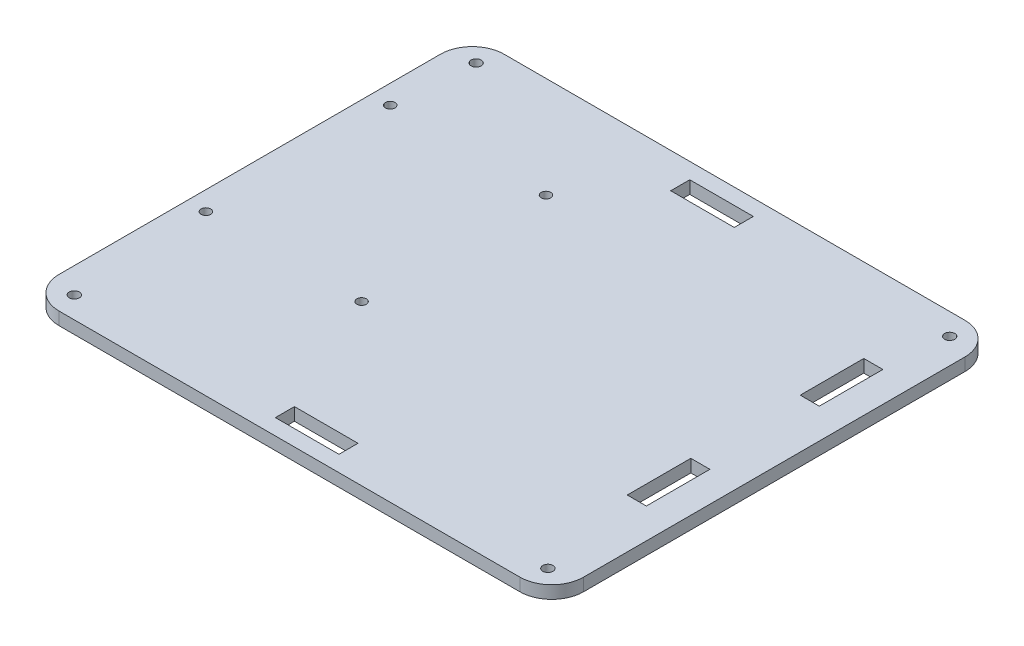
ISO-10303-21;
HEADER;
FILE_DESCRIPTION(('STEP AP214'),'2;1');
FILE_NAME('part.step','',(''),(''),'','','');
FILE_SCHEMA(('AUTOMOTIVE_DESIGN { 1 0 10303 214 1 1 1 1 }'));
ENDSEC;
DATA;
#1=APPLICATION_CONTEXT('core data for automotive mechanical design processes');
#2=APPLICATION_PROTOCOL_DEFINITION('international standard','automotive_design',2000,#1);
#3=PRODUCT_CONTEXT('',#1,'mechanical');
#4=PRODUCT('Part','Part','',(#3));
#5=PRODUCT_RELATED_PRODUCT_CATEGORY('part','',(#4));
#6=PRODUCT_DEFINITION_FORMATION('','',#4);
#7=PRODUCT_DEFINITION_CONTEXT('part definition',#1,'design');
#8=PRODUCT_DEFINITION('design','',#6,#7);
#9=PRODUCT_DEFINITION_SHAPE('','',#8);
#10=(LENGTH_UNIT() NAMED_UNIT(*) SI_UNIT(.MILLI.,.METRE.));
#11=(NAMED_UNIT(*) PLANE_ANGLE_UNIT() SI_UNIT($,.RADIAN.));
#12=(NAMED_UNIT(*) SI_UNIT($,.STERADIAN.) SOLID_ANGLE_UNIT());
#13=UNCERTAINTY_MEASURE_WITH_UNIT(LENGTH_MEASURE(1.E-05),#10,'distance_accuracy_value','');
#14=(GEOMETRIC_REPRESENTATION_CONTEXT(3) GLOBAL_UNCERTAINTY_ASSIGNED_CONTEXT((#13)) GLOBAL_UNIT_ASSIGNED_CONTEXT((#10,
#11,#12)) REPRESENTATION_CONTEXT('',''));
#15=CARTESIAN_POINT('',(0.,0.,0.));
#16=DIRECTION('',(0.,0.,1.));
#17=DIRECTION('',(1.,0.,0.));
#18=AXIS2_PLACEMENT_3D('',#15,#16,#17);
#19=CARTESIAN_POINT('',(82.5,4.,-70.));
#20=DIRECTION('',(-1.,0.,0.));
#21=DIRECTION('',(0.,0.,1.));
#22=AXIS2_PLACEMENT_3D('',#19,#20,#21);
#23=PLANE('',#22);
#24=DIRECTION('',(0.,0.,-1.));
#25=VECTOR('',#24,1.);
#26=CARTESIAN_POINT('',(82.5,0.,-70.));
#27=LINE('',#26,#25);
#28=CARTESIAN_POINT('',(82.5,0.,60.));
#29=VERTEX_POINT('',#28);
#30=CARTESIAN_POINT('',(82.5,0.,-60.));
#31=VERTEX_POINT('',#30);
#32=EDGE_CURVE('E332',#29,#31,#27,.T.);
#33=ORIENTED_EDGE('',*,*,#32,.T.);
#34=DIRECTION('',(0.,-1.,0.));
#35=VECTOR('',#34,1.);
#36=CARTESIAN_POINT('',(82.5,4.,-60.));
#37=LINE('',#36,#35);
#38=CARTESIAN_POINT('',(82.5,4.,-60.));
#39=VERTEX_POINT('',#38);
#40=EDGE_CURVE('E369',#31,#39,#37,.F.);
#41=ORIENTED_EDGE('',*,*,#40,.T.);
#42=DIRECTION('',(0.,0.,-1.));
#43=VECTOR('',#42,1.);
#44=CARTESIAN_POINT('',(82.5,4.,-70.));
#45=LINE('',#44,#43);
#46=CARTESIAN_POINT('',(82.5,4.,60.));
#47=VERTEX_POINT('',#46);
#48=EDGE_CURVE('E318',#47,#39,#45,.T.);
#49=ORIENTED_EDGE('',*,*,#48,.F.);
#50=DIRECTION('',(0.,-1.,0.));
#51=VECTOR('',#50,1.);
#52=CARTESIAN_POINT('',(82.5,4.,60.));
#53=LINE('',#52,#51);
#54=EDGE_CURVE('E366',#47,#29,#53,.T.);
#55=ORIENTED_EDGE('',*,*,#54,.T.);
#56=EDGE_LOOP('',(#33,#41,#49,#55));
#57=FACE_BOUND('',#56,.T.);
#58=ADVANCED_FACE('F41',(#57),#23,.F.);
#59=CARTESIAN_POINT('',(-82.5,4.,-70.));
#60=DIRECTION('',(0.,0.,1.));
#61=DIRECTION('',(1.,0.,0.));
#62=AXIS2_PLACEMENT_3D('',#59,#60,#61);
#63=PLANE('',#62);
#64=DIRECTION('',(-1.,0.,0.));
#65=VECTOR('',#64,1.);
#66=CARTESIAN_POINT('',(-82.5,4.,-70.));
#67=LINE('',#66,#65);
#68=CARTESIAN_POINT('',(72.5,4.,-70.));
#69=VERTEX_POINT('',#68);
#70=CARTESIAN_POINT('',(-72.5,4.,-70.));
#71=VERTEX_POINT('',#70);
#72=EDGE_CURVE('E321',#69,#71,#67,.T.);
#73=ORIENTED_EDGE('',*,*,#72,.F.);
#74=DIRECTION('',(0.,-1.,0.));
#75=VECTOR('',#74,1.);
#76=CARTESIAN_POINT('',(72.5,4.,-70.));
#77=LINE('',#76,#75);
#78=CARTESIAN_POINT('',(72.5,0.,-70.));
#79=VERTEX_POINT('',#78);
#80=EDGE_CURVE('E355',#69,#79,#77,.T.);
#81=ORIENTED_EDGE('',*,*,#80,.T.);
#82=DIRECTION('',(-1.,0.,0.));
#83=VECTOR('',#82,1.);
#84=CARTESIAN_POINT('',(-82.5,0.,-70.));
#85=LINE('',#84,#83);
#86=CARTESIAN_POINT('',(-72.5,0.,-70.));
#87=VERTEX_POINT('',#86);
#88=EDGE_CURVE('E335',#79,#87,#85,.T.);
#89=ORIENTED_EDGE('',*,*,#88,.T.);
#90=DIRECTION('',(0.,-1.,0.));
#91=VECTOR('',#90,1.);
#92=CARTESIAN_POINT('',(-72.5,4.,-70.));
#93=LINE('',#92,#91);
#94=EDGE_CURVE('E331',#87,#71,#93,.F.);
#95=ORIENTED_EDGE('',*,*,#94,.T.);
#96=EDGE_LOOP('',(#73,#81,#89,#95));
#97=FACE_BOUND('',#96,.T.);
#98=ADVANCED_FACE('F470',(#97),#63,.F.);
#99=CARTESIAN_POINT('',(-82.5,4.,-70.));
#100=DIRECTION('',(1.,0.,0.));
#101=DIRECTION('',(0.,0.,-1.));
#102=AXIS2_PLACEMENT_3D('',#99,#100,#101);
#103=PLANE('',#102);
#104=DIRECTION('',(0.,0.,1.));
#105=VECTOR('',#104,1.);
#106=CARTESIAN_POINT('',(-82.5,4.,-70.));
#107=LINE('',#106,#105);
#108=CARTESIAN_POINT('',(-82.5,4.,-60.));
#109=VERTEX_POINT('',#108);
#110=CARTESIAN_POINT('',(-82.5,4.,60.));
#111=VERTEX_POINT('',#110);
#112=EDGE_CURVE('E325',#109,#111,#107,.T.);
#113=ORIENTED_EDGE('',*,*,#112,.F.);
#114=DIRECTION('',(0.,-1.,0.));
#115=VECTOR('',#114,1.);
#116=CARTESIAN_POINT('',(-82.5,4.,-60.));
#117=LINE('',#116,#115);
#118=CARTESIAN_POINT('',(-82.5,0.,-60.));
#119=VERTEX_POINT('',#118);
#120=EDGE_CURVE('E386',#109,#119,#117,.T.);
#121=ORIENTED_EDGE('',*,*,#120,.T.);
#122=DIRECTION('',(0.,0.,1.));
#123=VECTOR('',#122,1.);
#124=CARTESIAN_POINT('',(-82.5,0.,-70.));
#125=LINE('',#124,#123);
#126=CARTESIAN_POINT('',(-82.5,0.,60.));
#127=VERTEX_POINT('',#126);
#128=EDGE_CURVE('E339',#119,#127,#125,.T.);
#129=ORIENTED_EDGE('',*,*,#128,.T.);
#130=DIRECTION('',(0.,-1.,0.));
#131=VECTOR('',#130,1.);
#132=CARTESIAN_POINT('',(-82.5,4.,60.));
#133=LINE('',#132,#131);
#134=EDGE_CURVE('E384',#127,#111,#133,.F.);
#135=ORIENTED_EDGE('',*,*,#134,.T.);
#136=EDGE_LOOP('',(#113,#121,#129,#135));
#137=FACE_BOUND('',#136,.T.);
#138=ADVANCED_FACE('F477',(#137),#103,.F.);
#139=CARTESIAN_POINT('',(-82.5,4.,70.));
#140=DIRECTION('',(0.,0.,-1.));
#141=DIRECTION('',(-1.,0.,0.));
#142=AXIS2_PLACEMENT_3D('',#139,#140,#141);
#143=PLANE('',#142);
#144=DIRECTION('',(1.,0.,0.));
#145=VECTOR('',#144,1.);
#146=CARTESIAN_POINT('',(-82.5,0.,70.));
#147=LINE('',#146,#145);
#148=CARTESIAN_POINT('',(-72.5,0.,70.));
#149=VERTEX_POINT('',#148);
#150=CARTESIAN_POINT('',(72.5,0.,70.));
#151=VERTEX_POINT('',#150);
#152=EDGE_CURVE('E322',#149,#151,#147,.T.);
#153=ORIENTED_EDGE('',*,*,#152,.T.);
#154=DIRECTION('',(0.,-1.,0.));
#155=VECTOR('',#154,1.);
#156=CARTESIAN_POINT('',(72.5,4.,70.));
#157=LINE('',#156,#155);
#158=CARTESIAN_POINT('',(72.5,4.,70.));
#159=VERTEX_POINT('',#158);
#160=EDGE_CURVE('E382',#151,#159,#157,.F.);
#161=ORIENTED_EDGE('',*,*,#160,.T.);
#162=DIRECTION('',(1.,0.,0.));
#163=VECTOR('',#162,1.);
#164=CARTESIAN_POINT('',(-82.5,4.,70.));
#165=LINE('',#164,#163);
#166=CARTESIAN_POINT('',(-72.5,4.,70.));
#167=VERTEX_POINT('',#166);
#168=EDGE_CURVE('E328',#167,#159,#165,.T.);
#169=ORIENTED_EDGE('',*,*,#168,.F.);
#170=DIRECTION('',(0.,-1.,0.));
#171=VECTOR('',#170,1.);
#172=CARTESIAN_POINT('',(-72.5,4.,70.));
#173=LINE('',#172,#171);
#174=EDGE_CURVE('E379',#167,#149,#173,.T.);
#175=ORIENTED_EDGE('',*,*,#174,.T.);
#176=EDGE_LOOP('',(#153,#161,#169,#175));
#177=FACE_BOUND('',#176,.T.);
#178=ADVANCED_FACE('F512',(#177),#143,.F.);
#179=CARTESIAN_POINT('',(0.,4.,0.));
#180=DIRECTION('',(0.,1.,0.));
#181=DIRECTION('',(0.,0.,1.));
#182=AXIS2_PLACEMENT_3D('',#179,#180,#181);
#183=PLANE('',#182);
#184=DIRECTION('',(0.,0.,-1.));
#185=VECTOR('',#184,1.);
#186=CARTESIAN_POINT('',(10.9306495459541,4.,-65.));
#187=LINE('',#186,#185);
#188=CARTESIAN_POINT('',(10.9306495459541,4.,-59.));
#189=VERTEX_POINT('',#188);
#190=CARTESIAN_POINT('',(10.9306495459541,4.,-65.));
#191=VERTEX_POINT('',#190);
#192=EDGE_CURVE('E56',#189,#191,#187,.T.);
#193=ORIENTED_EDGE('',*,*,#192,.F.);
#194=DIRECTION('',(1.,0.,0.));
#195=VECTOR('',#194,1.);
#196=CARTESIAN_POINT('',(-9.0693504540459,4.,-59.));
#197=LINE('',#196,#195);
#198=CARTESIAN_POINT('',(-9.0693504540459,4.,-59.));
#199=VERTEX_POINT('',#198);
#200=EDGE_CURVE('E258',#199,#189,#197,.T.);
#201=ORIENTED_EDGE('',*,*,#200,.F.);
#202=DIRECTION('',(0.,0.,1.));
#203=VECTOR('',#202,1.);
#204=CARTESIAN_POINT('',(-9.0693504540459,4.,-65.));
#205=LINE('',#204,#203);
#206=CARTESIAN_POINT('',(-9.0693504540459,4.,-65.));
#207=VERTEX_POINT('',#206);
#208=EDGE_CURVE('E267',#207,#199,#205,.T.);
#209=ORIENTED_EDGE('',*,*,#208,.F.);
#210=DIRECTION('',(-1.,0.,0.));
#211=VECTOR('',#210,1.);
#212=CARTESIAN_POINT('',(-9.0693504540459,4.,-65.));
#213=LINE('',#212,#211);
#214=EDGE_CURVE('E270',#191,#207,#213,.T.);
#215=ORIENTED_EDGE('',*,*,#214,.F.);
#216=EDGE_LOOP('',(#193,#201,#209,#215));
#217=FACE_BOUND('',#216,.T.);
#218=DIRECTION('',(0.,0.,-1.));
#219=VECTOR('',#218,1.);
#220=CARTESIAN_POINT('',(10.5500607322575,4.,59.));
#221=LINE('',#220,#219);
#222=CARTESIAN_POINT('',(10.5500607322575,4.,65.));
#223=VERTEX_POINT('',#222);
#224=CARTESIAN_POINT('',(10.5500607322575,4.,59.));
#225=VERTEX_POINT('',#224);
#226=EDGE_CURVE('E64',#223,#225,#221,.T.);
#227=ORIENTED_EDGE('',*,*,#226,.F.);
#228=DIRECTION('',(1.,0.,0.));
#229=VECTOR('',#228,1.);
#230=CARTESIAN_POINT('',(-9.44993926774252,4.,65.));
#231=LINE('',#230,#229);
#232=CARTESIAN_POINT('',(-9.44993926774252,4.,65.));
#233=VERTEX_POINT('',#232);
#234=EDGE_CURVE('E240',#233,#223,#231,.T.);
#235=ORIENTED_EDGE('',*,*,#234,.F.);
#236=DIRECTION('',(0.,0.,1.));
#237=VECTOR('',#236,1.);
#238=CARTESIAN_POINT('',(-9.44993926774252,4.,59.));
#239=LINE('',#238,#237);
#240=CARTESIAN_POINT('',(-9.44993926774252,4.,59.));
#241=VERTEX_POINT('',#240);
#242=EDGE_CURVE('E249',#241,#233,#239,.T.);
#243=ORIENTED_EDGE('',*,*,#242,.F.);
#244=DIRECTION('',(-1.,0.,0.));
#245=VECTOR('',#244,1.);
#246=CARTESIAN_POINT('',(-9.44993926774252,4.,59.));
#247=LINE('',#246,#245);
#248=EDGE_CURVE('E252',#225,#241,#247,.T.);
#249=ORIENTED_EDGE('',*,*,#248,.F.);
#250=EDGE_LOOP('',(#227,#235,#243,#249));
#251=FACE_BOUND('',#250,.T.);
#252=DIRECTION('',(0.,0.,-1.));
#253=VECTOR('',#252,1.);
#254=CARTESIAN_POINT('',(73.,4.,10.7351495170339));
#255=LINE('',#254,#253);
#256=CARTESIAN_POINT('',(73.,4.,30.7351495170339));
#257=VERTEX_POINT('',#256);
#258=CARTESIAN_POINT('',(73.,4.,10.7351495170339));
#259=VERTEX_POINT('',#258);
#260=EDGE_CURVE('E208',#257,#259,#255,.T.);
#261=ORIENTED_EDGE('',*,*,#260,.F.);
#262=DIRECTION('',(1.,0.,0.));
#263=VECTOR('',#262,1.);
#264=CARTESIAN_POINT('',(67.,4.,30.7351495170339));
#265=LINE('',#264,#263);
#266=CARTESIAN_POINT('',(67.,4.,30.7351495170339));
#267=VERTEX_POINT('',#266);
#268=EDGE_CURVE('E217',#267,#257,#265,.T.);
#269=ORIENTED_EDGE('',*,*,#268,.F.);
#270=DIRECTION('',(0.,0.,1.));
#271=VECTOR('',#270,1.);
#272=CARTESIAN_POINT('',(67.,4.,10.7351495170339));
#273=LINE('',#272,#271);
#274=CARTESIAN_POINT('',(67.,4.,10.7351495170339));
#275=VERTEX_POINT('',#274);
#276=EDGE_CURVE('E223',#275,#267,#273,.T.);
#277=ORIENTED_EDGE('',*,*,#276,.F.);
#278=DIRECTION('',(-1.,0.,0.));
#279=VECTOR('',#278,1.);
#280=CARTESIAN_POINT('',(67.,4.,10.7351495170339));
#281=LINE('',#280,#279);
#282=EDGE_CURVE('E230',#259,#275,#281,.T.);
#283=ORIENTED_EDGE('',*,*,#282,.F.);
#284=EDGE_LOOP('',(#261,#269,#277,#283));
#285=FACE_BOUND('',#284,.T.);
#286=DIRECTION('',(0.,0.,-1.));
#287=VECTOR('',#286,1.);
#288=CARTESIAN_POINT('',(73.,4.,-43.6809532072416));
#289=LINE('',#288,#287);
#290=CARTESIAN_POINT('',(73.,4.,-23.6809532072416));
#291=VERTEX_POINT('',#290);
#292=CARTESIAN_POINT('',(73.,4.,-43.6809532072416));
#293=VERTEX_POINT('',#292);
#294=EDGE_CURVE('E231',#291,#293,#289,.T.);
#295=ORIENTED_EDGE('',*,*,#294,.F.);
#296=DIRECTION('',(1.,0.,0.));
#297=VECTOR('',#296,1.);
#298=CARTESIAN_POINT('',(67.,4.,-23.6809532072416));
#299=LINE('',#298,#297);
#300=CARTESIAN_POINT('',(67.,4.,-23.6809532072416));
#301=VERTEX_POINT('',#300);
#302=EDGE_CURVE('E279',#301,#291,#299,.T.);
#303=ORIENTED_EDGE('',*,*,#302,.F.);
#304=DIRECTION('',(0.,0.,1.));
#305=VECTOR('',#304,1.);
#306=CARTESIAN_POINT('',(67.,4.,-43.6809532072416));
#307=LINE('',#306,#305);
#308=CARTESIAN_POINT('',(67.,4.,-43.6809532072416));
#309=VERTEX_POINT('',#308);
#310=EDGE_CURVE('E276',#309,#301,#307,.T.);
#311=ORIENTED_EDGE('',*,*,#310,.F.);
#312=DIRECTION('',(-1.,0.,0.));
#313=VECTOR('',#312,1.);
#314=CARTESIAN_POINT('',(67.,4.,-43.6809532072416));
#315=LINE('',#314,#313);
#316=EDGE_CURVE('E233',#293,#309,#315,.T.);
#317=ORIENTED_EDGE('',*,*,#316,.F.);
#318=EDGE_LOOP('',(#295,#303,#311,#317));
#319=FACE_BOUND('',#318,.T.);
#320=CARTESIAN_POINT('',(-27.5,4.,-38.1892243623113));
#321=DIRECTION('',(0.,1.,0.));
#322=DIRECTION('',(0.,0.,1.));
#323=AXIS2_PLACEMENT_3D('',#320,#321,#322);
#324=CIRCLE('',#323,1.5);
#325=CARTESIAN_POINT('',(-27.5,4.,-36.6892243623113));
#326=VERTEX_POINT('',#325);
#327=EDGE_CURVE('E295',#326,#326,#324,.T.);
#328=ORIENTED_EDGE('',*,*,#327,.F.);
#329=EDGE_LOOP('',(#328));
#330=FACE_BOUND('',#329,.T.);
#331=CARTESIAN_POINT('',(-76.5,4.,19.8107756376887));
#332=DIRECTION('',(0.,1.,0.));
#333=DIRECTION('',(0.,0.,1.));
#334=AXIS2_PLACEMENT_3D('',#331,#332,#333);
#335=CIRCLE('',#334,1.5);
#336=CARTESIAN_POINT('',(-76.5,4.,21.3107756376887));
#337=VERTEX_POINT('',#336);
#338=EDGE_CURVE('E294',#337,#337,#335,.T.);
#339=ORIENTED_EDGE('',*,*,#338,.F.);
#340=EDGE_LOOP('',(#339));
#341=FACE_BOUND('',#340,.T.);
#342=CARTESIAN_POINT('',(-27.5,4.,19.8107756376887));
#343=DIRECTION('',(0.,1.,0.));
#344=DIRECTION('',(0.,0.,1.));
#345=AXIS2_PLACEMENT_3D('',#342,#343,#344);
#346=CIRCLE('',#345,1.5);
#347=CARTESIAN_POINT('',(-27.5,4.,21.3107756376887));
#348=VERTEX_POINT('',#347);
#349=EDGE_CURVE('E285',#348,#348,#346,.T.);
#350=ORIENTED_EDGE('',*,*,#349,.F.);
#351=EDGE_LOOP('',(#350));
#352=FACE_BOUND('',#351,.T.);
#353=CARTESIAN_POINT('',(-76.5,4.,-38.1892243623113));
#354=DIRECTION('',(0.,1.,0.));
#355=DIRECTION('',(0.,0.,1.));
#356=AXIS2_PLACEMENT_3D('',#353,#354,#355);
#357=CIRCLE('',#356,1.5);
#358=CARTESIAN_POINT('',(-76.5,4.,-36.6892243623113));
#359=VERTEX_POINT('',#358);
#360=EDGE_CURVE('E298',#359,#359,#357,.T.);
#361=ORIENTED_EDGE('',*,*,#360,.F.);
#362=EDGE_LOOP('',(#361));
#363=FACE_BOUND('',#362,.T.);
#364=CARTESIAN_POINT('',(74.5,4.,-63.2121212121212));
#365=DIRECTION('',(0.,1.,0.));
#366=DIRECTION('',(0.,0.,1.));
#367=AXIS2_PLACEMENT_3D('',#364,#365,#366);
#368=CIRCLE('',#367,1.60000000000001);
#369=CARTESIAN_POINT('',(74.5,4.,-61.6121212121212));
#370=VERTEX_POINT('',#369);
#371=EDGE_CURVE('E311',#370,#370,#368,.T.);
#372=ORIENTED_EDGE('',*,*,#371,.F.);
#373=EDGE_LOOP('',(#372));
#374=FACE_BOUND('',#373,.T.);
#375=CARTESIAN_POINT('',(74.5,4.,63.2121212121212));
#376=DIRECTION('',(0.,1.,0.));
#377=DIRECTION('',(0.,0.,1.));
#378=AXIS2_PLACEMENT_3D('',#375,#376,#377);
#379=CIRCLE('',#378,1.60000000000001);
#380=CARTESIAN_POINT('',(74.5,4.,64.8121212121213));
#381=VERTEX_POINT('',#380);
#382=EDGE_CURVE('E308',#381,#381,#379,.T.);
#383=ORIENTED_EDGE('',*,*,#382,.F.);
#384=EDGE_LOOP('',(#383));
#385=FACE_BOUND('',#384,.T.);
#386=CARTESIAN_POINT('',(-74.5,4.,63.2121212121212));
#387=DIRECTION('',(0.,1.,0.));
#388=DIRECTION('',(0.,0.,1.));
#389=AXIS2_PLACEMENT_3D('',#386,#387,#388);
#390=CIRCLE('',#389,1.60000000000001);
#391=CARTESIAN_POINT('',(-74.5,4.,64.8121212121213));
#392=VERTEX_POINT('',#391);
#393=EDGE_CURVE('E304',#392,#392,#390,.T.);
#394=ORIENTED_EDGE('',*,*,#393,.F.);
#395=EDGE_LOOP('',(#394));
#396=FACE_BOUND('',#395,.T.);
#397=CARTESIAN_POINT('',(-74.5,4.,-63.2121212121212));
#398=DIRECTION('',(0.,1.,0.));
#399=DIRECTION('',(0.,0.,1.));
#400=AXIS2_PLACEMENT_3D('',#397,#398,#399);
#401=CIRCLE('',#400,1.60000000000001);
#402=CARTESIAN_POINT('',(-74.5,4.,-61.6121212121212));
#403=VERTEX_POINT('',#402);
#404=EDGE_CURVE('E307',#403,#403,#401,.T.);
#405=ORIENTED_EDGE('',*,*,#404,.F.);
#406=EDGE_LOOP('',(#405));
#407=FACE_BOUND('',#406,.T.);
#408=ORIENTED_EDGE('',*,*,#48,.T.);
#409=CARTESIAN_POINT('',(72.5,4.,-60.));
#410=DIRECTION('',(0.,1.,0.));
#411=DIRECTION('',(0.,0.,1.));
#412=AXIS2_PLACEMENT_3D('',#409,#410,#411);
#413=CIRCLE('',#412,10.);
#414=EDGE_CURVE('E377',#39,#69,#413,.T.);
#415=ORIENTED_EDGE('',*,*,#414,.T.);
#416=ORIENTED_EDGE('',*,*,#72,.T.);
#417=CARTESIAN_POINT('',(-72.5,4.,-60.));
#418=DIRECTION('',(0.,1.,0.));
#419=DIRECTION('',(0.,0.,1.));
#420=AXIS2_PLACEMENT_3D('',#417,#418,#419);
#421=CIRCLE('',#420,10.);
#422=EDGE_CURVE('E373',#71,#109,#421,.T.);
#423=ORIENTED_EDGE('',*,*,#422,.T.);
#424=ORIENTED_EDGE('',*,*,#112,.T.);
#425=CARTESIAN_POINT('',(-72.5,4.,60.));
#426=DIRECTION('',(0.,1.,0.));
#427=DIRECTION('',(0.,0.,1.));
#428=AXIS2_PLACEMENT_3D('',#425,#426,#427);
#429=CIRCLE('',#428,10.);
#430=EDGE_CURVE('E371',#111,#167,#429,.T.);
#431=ORIENTED_EDGE('',*,*,#430,.T.);
#432=ORIENTED_EDGE('',*,*,#168,.T.);
#433=CARTESIAN_POINT('',(72.5,4.,60.));
#434=DIRECTION('',(0.,1.,0.));
#435=DIRECTION('',(0.,0.,1.));
#436=AXIS2_PLACEMENT_3D('',#433,#434,#435);
#437=CIRCLE('',#436,10.);
#438=EDGE_CURVE('E375',#159,#47,#437,.T.);
#439=ORIENTED_EDGE('',*,*,#438,.T.);
#440=EDGE_LOOP('',(#408,#415,#416,#423,#424,#431,#432,#439));
#441=FACE_BOUND('',#440,.T.);
#442=ADVANCED_FACE('F227',(#217,#251,#285,#319,#330,#341,#352,#363,#374,#385,#396,#407,#441),
#183,.T.);
#443=CARTESIAN_POINT('',(0.,0.,0.));
#444=DIRECTION('',(0.,1.,0.));
#445=DIRECTION('',(0.,0.,1.));
#446=AXIS2_PLACEMENT_3D('',#443,#444,#445);
#447=PLANE('',#446);
#448=DIRECTION('',(1.,0.,0.));
#449=VECTOR('',#448,1.);
#450=CARTESIAN_POINT('',(0.,0.,-59.));
#451=LINE('',#450,#449);
#452=CARTESIAN_POINT('',(-9.0693504540459,0.,-59.));
#453=VERTEX_POINT('',#452);
#454=CARTESIAN_POINT('',(10.9306495459541,0.,-59.));
#455=VERTEX_POINT('',#454);
#456=EDGE_CURVE('E49',#453,#455,#451,.T.);
#457=ORIENTED_EDGE('',*,*,#456,.T.);
#458=DIRECTION('',(0.,0.,-1.));
#459=VECTOR('',#458,1.);
#460=CARTESIAN_POINT('',(10.9306495459541,0.,0.));
#461=LINE('',#460,#459);
#462=CARTESIAN_POINT('',(10.9306495459541,0.,-65.));
#463=VERTEX_POINT('',#462);
#464=EDGE_CURVE('E11',#455,#463,#461,.T.);
#465=ORIENTED_EDGE('',*,*,#464,.T.);
#466=DIRECTION('',(-1.,0.,0.));
#467=VECTOR('',#466,1.);
#468=CARTESIAN_POINT('',(0.,0.,-65.));
#469=LINE('',#468,#467);
#470=CARTESIAN_POINT('',(-9.0693504540459,0.,-65.));
#471=VERTEX_POINT('',#470);
#472=EDGE_CURVE('E432',#463,#471,#469,.T.);
#473=ORIENTED_EDGE('',*,*,#472,.T.);
#474=DIRECTION('',(0.,0.,1.));
#475=VECTOR('',#474,1.);
#476=CARTESIAN_POINT('',(-9.0693504540459,0.,0.));
#477=LINE('',#476,#475);
#478=EDGE_CURVE('E435',#471,#453,#477,.T.);
#479=ORIENTED_EDGE('',*,*,#478,.T.);
#480=EDGE_LOOP('',(#457,#465,#473,#479));
#481=FACE_BOUND('',#480,.T.);
#482=DIRECTION('',(1.,0.,0.));
#483=VECTOR('',#482,1.);
#484=CARTESIAN_POINT('',(0.,0.,65.));
#485=LINE('',#484,#483);
#486=CARTESIAN_POINT('',(-9.44993926774252,0.,65.));
#487=VERTEX_POINT('',#486);
#488=CARTESIAN_POINT('',(10.5500607322575,0.,65.));
#489=VERTEX_POINT('',#488);
#490=EDGE_CURVE('E426',#487,#489,#485,.T.);
#491=ORIENTED_EDGE('',*,*,#490,.T.);
#492=DIRECTION('',(0.,0.,-1.));
#493=VECTOR('',#492,1.);
#494=CARTESIAN_POINT('',(10.5500607322575,0.,0.));
#495=LINE('',#494,#493);
#496=CARTESIAN_POINT('',(10.5500607322575,0.,59.));
#497=VERTEX_POINT('',#496);
#498=EDGE_CURVE('E429',#489,#497,#495,.T.);
#499=ORIENTED_EDGE('',*,*,#498,.T.);
#500=DIRECTION('',(-1.,0.,0.));
#501=VECTOR('',#500,1.);
#502=CARTESIAN_POINT('',(0.,0.,59.));
#503=LINE('',#502,#501);
#504=CARTESIAN_POINT('',(-9.44993926774252,0.,59.));
#505=VERTEX_POINT('',#504);
#506=EDGE_CURVE('E420',#497,#505,#503,.T.);
#507=ORIENTED_EDGE('',*,*,#506,.T.);
#508=DIRECTION('',(0.,0.,1.));
#509=VECTOR('',#508,1.);
#510=CARTESIAN_POINT('',(-9.44993926774254,0.,0.));
#511=LINE('',#510,#509);
#512=EDGE_CURVE('E423',#505,#487,#511,.T.);
#513=ORIENTED_EDGE('',*,*,#512,.T.);
#514=EDGE_LOOP('',(#491,#499,#507,#513));
#515=FACE_BOUND('',#514,.T.);
#516=DIRECTION('',(1.,0.,0.));
#517=VECTOR('',#516,1.);
#518=CARTESIAN_POINT('',(0.,0.,30.7351495170339));
#519=LINE('',#518,#517);
#520=CARTESIAN_POINT('',(67.,0.,30.7351495170339));
#521=VERTEX_POINT('',#520);
#522=CARTESIAN_POINT('',(73.,0.,30.7351495170339));
#523=VERTEX_POINT('',#522);
#524=EDGE_CURVE('E417',#521,#523,#519,.T.);
#525=ORIENTED_EDGE('',*,*,#524,.T.);
#526=DIRECTION('',(0.,0.,-1.));
#527=VECTOR('',#526,1.);
#528=CARTESIAN_POINT('',(73.,0.,0.));
#529=LINE('',#528,#527);
#530=CARTESIAN_POINT('',(73.,0.,10.7351495170339));
#531=VERTEX_POINT('',#530);
#532=EDGE_CURVE('E211',#523,#531,#529,.T.);
#533=ORIENTED_EDGE('',*,*,#532,.T.);
#534=DIRECTION('',(-1.,0.,0.));
#535=VECTOR('',#534,1.);
#536=CARTESIAN_POINT('',(0.,0.,10.7351495170339));
#537=LINE('',#536,#535);
#538=CARTESIAN_POINT('',(67.,0.,10.7351495170339));
#539=VERTEX_POINT('',#538);
#540=EDGE_CURVE('E411',#531,#539,#537,.T.);
#541=ORIENTED_EDGE('',*,*,#540,.T.);
#542=DIRECTION('',(0.,0.,1.));
#543=VECTOR('',#542,1.);
#544=CARTESIAN_POINT('',(67.,0.,0.));
#545=LINE('',#544,#543);
#546=EDGE_CURVE('E414',#539,#521,#545,.T.);
#547=ORIENTED_EDGE('',*,*,#546,.T.);
#548=EDGE_LOOP('',(#525,#533,#541,#547));
#549=FACE_BOUND('',#548,.T.);
#550=DIRECTION('',(1.,0.,0.));
#551=VECTOR('',#550,1.);
#552=CARTESIAN_POINT('',(0.,0.,-23.6809532072416));
#553=LINE('',#552,#551);
#554=CARTESIAN_POINT('',(67.,0.,-23.6809532072416));
#555=VERTEX_POINT('',#554);
#556=CARTESIAN_POINT('',(73.,0.,-23.6809532072416));
#557=VERTEX_POINT('',#556);
#558=EDGE_CURVE('E405',#555,#557,#553,.T.);
#559=ORIENTED_EDGE('',*,*,#558,.T.);
#560=DIRECTION('',(0.,0.,-1.));
#561=VECTOR('',#560,1.);
#562=CARTESIAN_POINT('',(73.,0.,0.));
#563=LINE('',#562,#561);
#564=CARTESIAN_POINT('',(73.,0.,-43.6809532072416));
#565=VERTEX_POINT('',#564);
#566=EDGE_CURVE('E408',#557,#565,#563,.T.);
#567=ORIENTED_EDGE('',*,*,#566,.T.);
#568=DIRECTION('',(-1.,0.,0.));
#569=VECTOR('',#568,1.);
#570=CARTESIAN_POINT('',(0.,0.,-43.6809532072416));
#571=LINE('',#570,#569);
#572=CARTESIAN_POINT('',(67.,0.,-43.6809532072416));
#573=VERTEX_POINT('',#572);
#574=EDGE_CURVE('E389',#565,#573,#571,.T.);
#575=ORIENTED_EDGE('',*,*,#574,.T.);
#576=DIRECTION('',(0.,0.,1.));
#577=VECTOR('',#576,1.);
#578=CARTESIAN_POINT('',(67.,0.,0.));
#579=LINE('',#578,#577);
#580=EDGE_CURVE('E402',#573,#555,#579,.T.);
#581=ORIENTED_EDGE('',*,*,#580,.T.);
#582=EDGE_LOOP('',(#559,#567,#575,#581));
#583=FACE_BOUND('',#582,.T.);
#584=CARTESIAN_POINT('',(-27.5,0.,-38.1892243623113));
#585=DIRECTION('',(0.,1.,0.));
#586=DIRECTION('',(0.,0.,1.));
#587=AXIS2_PLACEMENT_3D('',#584,#585,#586);
#588=CIRCLE('',#587,1.5);
#589=CARTESIAN_POINT('',(-27.5,0.,-36.6892243623113));
#590=VERTEX_POINT('',#589);
#591=EDGE_CURVE('E314',#590,#590,#588,.T.);
#592=ORIENTED_EDGE('',*,*,#591,.T.);
#593=EDGE_LOOP('',(#592));
#594=FACE_BOUND('',#593,.T.);
#595=CARTESIAN_POINT('',(-76.5,0.,19.8107756376887));
#596=DIRECTION('',(0.,1.,0.));
#597=DIRECTION('',(0.,0.,1.));
#598=AXIS2_PLACEMENT_3D('',#595,#596,#597);
#599=CIRCLE('',#598,1.5);
#600=CARTESIAN_POINT('',(-76.5,0.,21.3107756376887));
#601=VERTEX_POINT('',#600);
#602=EDGE_CURVE('E395',#601,#601,#599,.T.);
#603=ORIENTED_EDGE('',*,*,#602,.T.);
#604=EDGE_LOOP('',(#603));
#605=FACE_BOUND('',#604,.T.);
#606=CARTESIAN_POINT('',(-27.5,0.,19.8107756376887));
#607=DIRECTION('',(0.,1.,0.));
#608=DIRECTION('',(0.,0.,1.));
#609=AXIS2_PLACEMENT_3D('',#606,#607,#608);
#610=CIRCLE('',#609,1.5);
#611=CARTESIAN_POINT('',(-27.5,0.,21.3107756376887));
#612=VERTEX_POINT('',#611);
#613=EDGE_CURVE('E392',#612,#612,#610,.T.);
#614=ORIENTED_EDGE('',*,*,#613,.T.);
#615=EDGE_LOOP('',(#614));
#616=FACE_BOUND('',#615,.T.);
#617=CARTESIAN_POINT('',(-76.5,0.,-38.1892243623113));
#618=DIRECTION('',(0.,1.,0.));
#619=DIRECTION('',(0.,0.,1.));
#620=AXIS2_PLACEMENT_3D('',#617,#618,#619);
#621=CIRCLE('',#620,1.5);
#622=CARTESIAN_POINT('',(-76.5,0.,-36.6892243623113));
#623=VERTEX_POINT('',#622);
#624=EDGE_CURVE('E303',#623,#623,#621,.T.);
#625=ORIENTED_EDGE('',*,*,#624,.T.);
#626=EDGE_LOOP('',(#625));
#627=FACE_BOUND('',#626,.T.);
#628=CARTESIAN_POINT('',(74.5,0.,-63.2121212121212));
#629=DIRECTION('',(0.,1.,0.));
#630=DIRECTION('',(0.,0.,1.));
#631=AXIS2_PLACEMENT_3D('',#628,#629,#630);
#632=CIRCLE('',#631,1.60000000000001);
#633=CARTESIAN_POINT('',(74.5,0.,-61.6121212121212));
#634=VERTEX_POINT('',#633);
#635=EDGE_CURVE('E336',#634,#634,#632,.T.);
#636=ORIENTED_EDGE('',*,*,#635,.T.);
#637=EDGE_LOOP('',(#636));
#638=FACE_BOUND('',#637,.T.);
#639=CARTESIAN_POINT('',(74.5,0.,63.2121212121212));
#640=DIRECTION('',(0.,1.,0.));
#641=DIRECTION('',(0.,0.,1.));
#642=AXIS2_PLACEMENT_3D('',#639,#640,#641);
#643=CIRCLE('',#642,1.60000000000001);
#644=CARTESIAN_POINT('',(74.5,0.,64.8121212121213));
#645=VERTEX_POINT('',#644);
#646=EDGE_CURVE('E349',#645,#645,#643,.T.);
#647=ORIENTED_EDGE('',*,*,#646,.T.);
#648=EDGE_LOOP('',(#647));
#649=FACE_BOUND('',#648,.T.);
#650=CARTESIAN_POINT('',(-74.5,0.,63.2121212121212));
#651=DIRECTION('',(0.,1.,0.));
#652=DIRECTION('',(0.,0.,1.));
#653=AXIS2_PLACEMENT_3D('',#650,#651,#652);
#654=CIRCLE('',#653,1.60000000000001);
#655=CARTESIAN_POINT('',(-74.5,0.,64.8121212121213));
#656=VERTEX_POINT('',#655);
#657=EDGE_CURVE('E346',#656,#656,#654,.T.);
#658=ORIENTED_EDGE('',*,*,#657,.T.);
#659=EDGE_LOOP('',(#658));
#660=FACE_BOUND('',#659,.T.);
#661=CARTESIAN_POINT('',(-74.5,0.,-63.2121212121212));
#662=DIRECTION('',(0.,1.,0.));
#663=DIRECTION('',(0.,0.,1.));
#664=AXIS2_PLACEMENT_3D('',#661,#662,#663);
#665=CIRCLE('',#664,1.60000000000001);
#666=CARTESIAN_POINT('',(-74.5,0.,-61.6121212121212));
#667=VERTEX_POINT('',#666);
#668=EDGE_CURVE('E317',#667,#667,#665,.T.);
#669=ORIENTED_EDGE('',*,*,#668,.T.);
#670=EDGE_LOOP('',(#669));
#671=FACE_BOUND('',#670,.T.);
#672=ORIENTED_EDGE('',*,*,#88,.F.);
#673=CARTESIAN_POINT('',(72.5,0.,-60.));
#674=DIRECTION('',(0.,1.,0.));
#675=DIRECTION('',(0.,0.,1.));
#676=AXIS2_PLACEMENT_3D('',#673,#674,#675);
#677=CIRCLE('',#676,10.);
#678=EDGE_CURVE('E364',#79,#31,#677,.F.);
#679=ORIENTED_EDGE('',*,*,#678,.T.);
#680=ORIENTED_EDGE('',*,*,#32,.F.);
#681=CARTESIAN_POINT('',(72.5,0.,60.));
#682=DIRECTION('',(0.,1.,0.));
#683=DIRECTION('',(0.,0.,1.));
#684=AXIS2_PLACEMENT_3D('',#681,#682,#683);
#685=CIRCLE('',#684,10.);
#686=EDGE_CURVE('E362',#29,#151,#685,.F.);
#687=ORIENTED_EDGE('',*,*,#686,.T.);
#688=ORIENTED_EDGE('',*,*,#152,.F.);
#689=CARTESIAN_POINT('',(-72.5,0.,60.));
#690=DIRECTION('',(0.,1.,0.));
#691=DIRECTION('',(0.,0.,1.));
#692=AXIS2_PLACEMENT_3D('',#689,#690,#691);
#693=CIRCLE('',#692,10.);
#694=EDGE_CURVE('E358',#149,#127,#693,.F.);
#695=ORIENTED_EDGE('',*,*,#694,.T.);
#696=ORIENTED_EDGE('',*,*,#128,.F.);
#697=CARTESIAN_POINT('',(-72.5,0.,-60.));
#698=DIRECTION('',(0.,1.,0.));
#699=DIRECTION('',(0.,0.,1.));
#700=AXIS2_PLACEMENT_3D('',#697,#698,#699);
#701=CIRCLE('',#700,10.);
#702=EDGE_CURVE('E360',#119,#87,#701,.F.);
#703=ORIENTED_EDGE('',*,*,#702,.T.);
#704=EDGE_LOOP('',(#672,#679,#680,#687,#688,#695,#696,#703));
#705=FACE_BOUND('',#704,.T.);
#706=ADVANCED_FACE('F439',(#481,#515,#549,#583,#594,#605,#616,#627,#638,#649,#660,#671,#705),
#447,.F.);
#707=CARTESIAN_POINT('',(-74.5,-6.,-63.2121212121212));
#708=DIRECTION('',(0.,1.,0.));
#709=DIRECTION('',(0.,0.,1.));
#710=AXIS2_PLACEMENT_3D('',#707,#708,#709);
#711=CYLINDRICAL_SURFACE('',#710,1.60000000000001);
#712=ORIENTED_EDGE('',*,*,#404,.T.);
#713=EDGE_LOOP('',(#712));
#714=FACE_BOUND('',#713,.T.);
#715=ORIENTED_EDGE('',*,*,#668,.F.);
#716=EDGE_LOOP('',(#715));
#717=FACE_BOUND('',#716,.T.);
#718=ADVANCED_FACE('F524',(#714,#717),#711,.F.);
#719=CARTESIAN_POINT('',(-74.5,-6.,63.2121212121212));
#720=DIRECTION('',(0.,1.,0.));
#721=DIRECTION('',(0.,0.,1.));
#722=AXIS2_PLACEMENT_3D('',#719,#720,#721);
#723=CYLINDRICAL_SURFACE('',#722,1.60000000000001);
#724=ORIENTED_EDGE('',*,*,#393,.T.);
#725=EDGE_LOOP('',(#724));
#726=FACE_BOUND('',#725,.T.);
#727=ORIENTED_EDGE('',*,*,#657,.F.);
#728=EDGE_LOOP('',(#727));
#729=FACE_BOUND('',#728,.T.);
#730=ADVANCED_FACE('F531',(#726,#729),#723,.F.);
#731=CARTESIAN_POINT('',(74.5,-6.,63.2121212121212));
#732=DIRECTION('',(0.,1.,0.));
#733=DIRECTION('',(0.,0.,1.));
#734=AXIS2_PLACEMENT_3D('',#731,#732,#733);
#735=CYLINDRICAL_SURFACE('',#734,1.60000000000001);
#736=ORIENTED_EDGE('',*,*,#382,.T.);
#737=EDGE_LOOP('',(#736));
#738=FACE_BOUND('',#737,.T.);
#739=ORIENTED_EDGE('',*,*,#646,.F.);
#740=EDGE_LOOP('',(#739));
#741=FACE_BOUND('',#740,.T.);
#742=ADVANCED_FACE('F748',(#738,#741),#735,.F.);
#743=CARTESIAN_POINT('',(74.5,-6.,-63.2121212121212));
#744=DIRECTION('',(0.,1.,0.));
#745=DIRECTION('',(0.,0.,1.));
#746=AXIS2_PLACEMENT_3D('',#743,#744,#745);
#747=CYLINDRICAL_SURFACE('',#746,1.60000000000001);
#748=ORIENTED_EDGE('',*,*,#371,.T.);
#749=EDGE_LOOP('',(#748));
#750=FACE_BOUND('',#749,.T.);
#751=ORIENTED_EDGE('',*,*,#635,.F.);
#752=EDGE_LOOP('',(#751));
#753=FACE_BOUND('',#752,.T.);
#754=ADVANCED_FACE('F486',(#750,#753),#747,.F.);
#755=CARTESIAN_POINT('',(72.5,4.,-60.));
#756=DIRECTION('',(0.,-1.,0.));
#757=DIRECTION('',(0.,0.,-1.));
#758=AXIS2_PLACEMENT_3D('',#755,#756,#757);
#759=CYLINDRICAL_SURFACE('',#758,10.);
#760=ORIENTED_EDGE('',*,*,#414,.F.);
#761=ORIENTED_EDGE('',*,*,#40,.F.);
#762=ORIENTED_EDGE('',*,*,#678,.F.);
#763=ORIENTED_EDGE('',*,*,#80,.F.);
#764=EDGE_LOOP('',(#760,#761,#762,#763));
#765=FACE_BOUND('',#764,.T.);
#766=ADVANCED_FACE('F482',(#765),#759,.T.);
#767=CARTESIAN_POINT('',(72.5,4.,60.));
#768=DIRECTION('',(0.,-1.,0.));
#769=DIRECTION('',(0.,0.,-1.));
#770=AXIS2_PLACEMENT_3D('',#767,#768,#769);
#771=CYLINDRICAL_SURFACE('',#770,10.);
#772=ORIENTED_EDGE('',*,*,#438,.F.);
#773=ORIENTED_EDGE('',*,*,#160,.F.);
#774=ORIENTED_EDGE('',*,*,#686,.F.);
#775=ORIENTED_EDGE('',*,*,#54,.F.);
#776=EDGE_LOOP('',(#772,#773,#774,#775));
#777=FACE_BOUND('',#776,.T.);
#778=ADVANCED_FACE('F485',(#777),#771,.T.);
#779=CARTESIAN_POINT('',(-72.5,4.,-60.));
#780=DIRECTION('',(0.,-1.,0.));
#781=DIRECTION('',(0.,0.,-1.));
#782=AXIS2_PLACEMENT_3D('',#779,#780,#781);
#783=CYLINDRICAL_SURFACE('',#782,10.);
#784=ORIENTED_EDGE('',*,*,#422,.F.);
#785=ORIENTED_EDGE('',*,*,#94,.F.);
#786=ORIENTED_EDGE('',*,*,#702,.F.);
#787=ORIENTED_EDGE('',*,*,#120,.F.);
#788=EDGE_LOOP('',(#784,#785,#786,#787));
#789=FACE_BOUND('',#788,.T.);
#790=ADVANCED_FACE('F489',(#789),#783,.T.);
#791=CARTESIAN_POINT('',(-72.5,4.,60.));
#792=DIRECTION('',(0.,-1.,0.));
#793=DIRECTION('',(0.,0.,-1.));
#794=AXIS2_PLACEMENT_3D('',#791,#792,#793);
#795=CYLINDRICAL_SURFACE('',#794,10.);
#796=ORIENTED_EDGE('',*,*,#430,.F.);
#797=ORIENTED_EDGE('',*,*,#134,.F.);
#798=ORIENTED_EDGE('',*,*,#694,.F.);
#799=ORIENTED_EDGE('',*,*,#174,.F.);
#800=EDGE_LOOP('',(#796,#797,#798,#799));
#801=FACE_BOUND('',#800,.T.);
#802=ADVANCED_FACE('F43',(#801),#795,.T.);
#803=CARTESIAN_POINT('',(-76.5,-6.,-38.1892243623113));
#804=DIRECTION('',(0.,1.,0.));
#805=DIRECTION('',(0.,0.,1.));
#806=AXIS2_PLACEMENT_3D('',#803,#804,#805);
#807=CYLINDRICAL_SURFACE('',#806,1.5);
#808=ORIENTED_EDGE('',*,*,#360,.T.);
#809=EDGE_LOOP('',(#808));
#810=FACE_BOUND('',#809,.T.);
#811=ORIENTED_EDGE('',*,*,#624,.F.);
#812=EDGE_LOOP('',(#811));
#813=FACE_BOUND('',#812,.T.);
#814=ADVANCED_FACE('F496',(#810,#813),#807,.F.);
#815=CARTESIAN_POINT('',(-27.5,-6.,19.8107756376887));
#816=DIRECTION('',(0.,1.,0.));
#817=DIRECTION('',(0.,0.,1.));
#818=AXIS2_PLACEMENT_3D('',#815,#816,#817);
#819=CYLINDRICAL_SURFACE('',#818,1.5);
#820=ORIENTED_EDGE('',*,*,#349,.T.);
#821=EDGE_LOOP('',(#820));
#822=FACE_BOUND('',#821,.T.);
#823=ORIENTED_EDGE('',*,*,#613,.F.);
#824=EDGE_LOOP('',(#823));
#825=FACE_BOUND('',#824,.T.);
#826=ADVANCED_FACE('F579',(#822,#825),#819,.F.);
#827=CARTESIAN_POINT('',(-76.5,-6.,19.8107756376887));
#828=DIRECTION('',(0.,1.,0.));
#829=DIRECTION('',(0.,0.,1.));
#830=AXIS2_PLACEMENT_3D('',#827,#828,#829);
#831=CYLINDRICAL_SURFACE('',#830,1.5);
#832=ORIENTED_EDGE('',*,*,#338,.T.);
#833=EDGE_LOOP('',(#832));
#834=FACE_BOUND('',#833,.T.);
#835=ORIENTED_EDGE('',*,*,#602,.F.);
#836=EDGE_LOOP('',(#835));
#837=FACE_BOUND('',#836,.T.);
#838=ADVANCED_FACE('F589',(#834,#837),#831,.F.);
#839=CARTESIAN_POINT('',(-27.5,-6.,-38.1892243623113));
#840=DIRECTION('',(0.,1.,0.));
#841=DIRECTION('',(0.,0.,1.));
#842=AXIS2_PLACEMENT_3D('',#839,#840,#841);
#843=CYLINDRICAL_SURFACE('',#842,1.5);
#844=ORIENTED_EDGE('',*,*,#327,.T.);
#845=EDGE_LOOP('',(#844));
#846=FACE_BOUND('',#845,.T.);
#847=ORIENTED_EDGE('',*,*,#591,.F.);
#848=EDGE_LOOP('',(#847));
#849=FACE_BOUND('',#848,.T.);
#850=ADVANCED_FACE('F599',(#846,#849),#843,.F.);
#851=CARTESIAN_POINT('',(73.,-6.,-43.6809532072416));
#852=DIRECTION('',(1.,0.,0.));
#853=DIRECTION('',(0.,0.,-1.));
#854=AXIS2_PLACEMENT_3D('',#851,#852,#853);
#855=PLANE('',#854);
#856=DIRECTION('',(0.,1.,0.));
#857=VECTOR('',#856,1.);
#858=CARTESIAN_POINT('',(73.,-6.,-23.6809532072416));
#859=LINE('',#858,#857);
#860=EDGE_CURVE('E283',#557,#291,#859,.T.);
#861=ORIENTED_EDGE('',*,*,#860,.T.);
#862=ORIENTED_EDGE('',*,*,#294,.T.);
#863=DIRECTION('',(0.,1.,0.));
#864=VECTOR('',#863,1.);
#865=CARTESIAN_POINT('',(73.,-6.,-43.6809532072416));
#866=LINE('',#865,#864);
#867=EDGE_CURVE('E282',#565,#293,#866,.T.);
#868=ORIENTED_EDGE('',*,*,#867,.F.);
#869=ORIENTED_EDGE('',*,*,#566,.F.);
#870=EDGE_LOOP('',(#861,#862,#868,#869));
#871=FACE_BOUND('',#870,.T.);
#872=ADVANCED_FACE('F609',(#871),#855,.F.);
#873=CARTESIAN_POINT('',(67.,-6.,-23.6809532072416));
#874=DIRECTION('',(0.,0.,1.));
#875=DIRECTION('',(1.,0.,0.));
#876=AXIS2_PLACEMENT_3D('',#873,#874,#875);
#877=PLANE('',#876);
#878=DIRECTION('',(0.,1.,0.));
#879=VECTOR('',#878,1.);
#880=CARTESIAN_POINT('',(67.,-6.,-23.6809532072416));
#881=LINE('',#880,#879);
#882=EDGE_CURVE('E286',#555,#301,#881,.T.);
#883=ORIENTED_EDGE('',*,*,#882,.T.);
#884=ORIENTED_EDGE('',*,*,#302,.T.);
#885=ORIENTED_EDGE('',*,*,#860,.F.);
#886=ORIENTED_EDGE('',*,*,#558,.F.);
#887=EDGE_LOOP('',(#883,#884,#885,#886));
#888=FACE_BOUND('',#887,.T.);
#889=ADVANCED_FACE('F618',(#888),#877,.F.);
#890=CARTESIAN_POINT('',(67.,-6.,-43.6809532072416));
#891=DIRECTION('',(-1.,0.,0.));
#892=DIRECTION('',(0.,0.,1.));
#893=AXIS2_PLACEMENT_3D('',#890,#891,#892);
#894=PLANE('',#893);
#895=DIRECTION('',(0.,1.,0.));
#896=VECTOR('',#895,1.);
#897=CARTESIAN_POINT('',(67.,-6.,-43.6809532072416));
#898=LINE('',#897,#896);
#899=EDGE_CURVE('E288',#573,#309,#898,.T.);
#900=ORIENTED_EDGE('',*,*,#899,.T.);
#901=ORIENTED_EDGE('',*,*,#310,.T.);
#902=ORIENTED_EDGE('',*,*,#882,.F.);
#903=ORIENTED_EDGE('',*,*,#580,.F.);
#904=EDGE_LOOP('',(#900,#901,#902,#903));
#905=FACE_BOUND('',#904,.T.);
#906=ADVANCED_FACE('F628',(#905),#894,.F.);
#907=CARTESIAN_POINT('',(67.,-6.,-43.6809532072416));
#908=DIRECTION('',(0.,0.,-1.));
#909=DIRECTION('',(-1.,0.,0.));
#910=AXIS2_PLACEMENT_3D('',#907,#908,#909);
#911=PLANE('',#910);
#912=ORIENTED_EDGE('',*,*,#867,.T.);
#913=ORIENTED_EDGE('',*,*,#316,.T.);
#914=ORIENTED_EDGE('',*,*,#899,.F.);
#915=ORIENTED_EDGE('',*,*,#574,.F.);
#916=EDGE_LOOP('',(#912,#913,#914,#915));
#917=FACE_BOUND('',#916,.T.);
#918=ADVANCED_FACE('F638',(#917),#911,.F.);
#919=CARTESIAN_POINT('',(73.,-6.,10.7351495170339));
#920=DIRECTION('',(1.,0.,0.));
#921=DIRECTION('',(0.,0.,-1.));
#922=AXIS2_PLACEMENT_3D('',#919,#920,#921);
#923=PLANE('',#922);
#924=DIRECTION('',(0.,1.,0.));
#925=VECTOR('',#924,1.);
#926=CARTESIAN_POINT('',(73.,-6.,30.7351495170339));
#927=LINE('',#926,#925);
#928=EDGE_CURVE('E203',#523,#257,#927,.T.);
#929=ORIENTED_EDGE('',*,*,#928,.T.);
#930=ORIENTED_EDGE('',*,*,#260,.T.);
#931=DIRECTION('',(0.,1.,0.));
#932=VECTOR('',#931,1.);
#933=CARTESIAN_POINT('',(73.,-6.,10.7351495170339));
#934=LINE('',#933,#932);
#935=EDGE_CURVE('E224',#531,#259,#934,.T.);
#936=ORIENTED_EDGE('',*,*,#935,.F.);
#937=ORIENTED_EDGE('',*,*,#532,.F.);
#938=EDGE_LOOP('',(#929,#930,#936,#937));
#939=FACE_BOUND('',#938,.T.);
#940=ADVANCED_FACE('F205',(#939),#923,.F.);
#941=CARTESIAN_POINT('',(67.,-6.,30.7351495170339));
#942=DIRECTION('',(0.,0.,1.));
#943=DIRECTION('',(1.,0.,0.));
#944=AXIS2_PLACEMENT_3D('',#941,#942,#943);
#945=PLANE('',#944);
#946=DIRECTION('',(0.,1.,0.));
#947=VECTOR('',#946,1.);
#948=CARTESIAN_POINT('',(67.,-6.,30.7351495170339));
#949=LINE('',#948,#947);
#950=EDGE_CURVE('E214',#521,#267,#949,.T.);
#951=ORIENTED_EDGE('',*,*,#950,.T.);
#952=ORIENTED_EDGE('',*,*,#268,.T.);
#953=ORIENTED_EDGE('',*,*,#928,.F.);
#954=ORIENTED_EDGE('',*,*,#524,.F.);
#955=EDGE_LOOP('',(#951,#952,#953,#954));
#956=FACE_BOUND('',#955,.T.);
#957=ADVANCED_FACE('F218',(#956),#945,.F.);
#958=CARTESIAN_POINT('',(67.,-6.,10.7351495170339));
#959=DIRECTION('',(-1.,0.,0.));
#960=DIRECTION('',(0.,0.,1.));
#961=AXIS2_PLACEMENT_3D('',#958,#959,#960);
#962=PLANE('',#961);
#963=DIRECTION('',(0.,1.,0.));
#964=VECTOR('',#963,1.);
#965=CARTESIAN_POINT('',(67.,-6.,10.7351495170339));
#966=LINE('',#965,#964);
#967=EDGE_CURVE('E854',#539,#275,#966,.T.);
#968=ORIENTED_EDGE('',*,*,#967,.T.);
#969=ORIENTED_EDGE('',*,*,#276,.T.);
#970=ORIENTED_EDGE('',*,*,#950,.F.);
#971=ORIENTED_EDGE('',*,*,#546,.F.);
#972=EDGE_LOOP('',(#968,#969,#970,#971));
#973=FACE_BOUND('',#972,.T.);
#974=ADVANCED_FACE('F665',(#973),#962,.F.);
#975=CARTESIAN_POINT('',(67.,-6.,10.7351495170339));
#976=DIRECTION('',(0.,0.,-1.));
#977=DIRECTION('',(-1.,0.,0.));
#978=AXIS2_PLACEMENT_3D('',#975,#976,#977);
#979=PLANE('',#978);
#980=ORIENTED_EDGE('',*,*,#935,.T.);
#981=ORIENTED_EDGE('',*,*,#282,.T.);
#982=ORIENTED_EDGE('',*,*,#967,.F.);
#983=ORIENTED_EDGE('',*,*,#540,.F.);
#984=EDGE_LOOP('',(#980,#981,#982,#983));
#985=FACE_BOUND('',#984,.T.);
#986=ADVANCED_FACE('F674',(#985),#979,.F.);
#987=CARTESIAN_POINT('',(10.5500607322575,-6.,59.));
#988=DIRECTION('',(1.,0.,0.));
#989=DIRECTION('',(0.,0.,-1.));
#990=AXIS2_PLACEMENT_3D('',#987,#988,#989);
#991=PLANE('',#990);
#992=DIRECTION('',(0.,1.,0.));
#993=VECTOR('',#992,1.);
#994=CARTESIAN_POINT('',(10.5500607322575,-6.,65.));
#995=LINE('',#994,#993);
#996=EDGE_CURVE('E245',#489,#223,#995,.T.);
#997=ORIENTED_EDGE('',*,*,#996,.T.);
#998=ORIENTED_EDGE('',*,*,#226,.T.);
#999=DIRECTION('',(0.,1.,0.));
#1000=VECTOR('',#999,1.);
#1001=CARTESIAN_POINT('',(10.5500607322575,-6.,59.));
#1002=LINE('',#1001,#1000);
#1003=EDGE_CURVE('E238',#497,#225,#1002,.T.);
#1004=ORIENTED_EDGE('',*,*,#1003,.F.);
#1005=ORIENTED_EDGE('',*,*,#498,.F.);
#1006=EDGE_LOOP('',(#997,#998,#1004,#1005));
#1007=FACE_BOUND('',#1006,.T.);
#1008=ADVANCED_FACE('F684',(#1007),#991,.F.);
#1009=CARTESIAN_POINT('',(-9.44993926774252,-6.,65.));
#1010=DIRECTION('',(0.,0.,1.));
#1011=DIRECTION('',(1.,0.,0.));
#1012=AXIS2_PLACEMENT_3D('',#1009,#1010,#1011);
#1013=PLANE('',#1012);
#1014=DIRECTION('',(0.,1.,0.));
#1015=VECTOR('',#1014,1.);
#1016=CARTESIAN_POINT('',(-9.44993926774252,-6.,65.));
#1017=LINE('',#1016,#1015);
#1018=EDGE_CURVE('E243',#487,#233,#1017,.T.);
#1019=ORIENTED_EDGE('',*,*,#1018,.T.);
#1020=ORIENTED_EDGE('',*,*,#234,.T.);
#1021=ORIENTED_EDGE('',*,*,#996,.F.);
#1022=ORIENTED_EDGE('',*,*,#490,.F.);
#1023=EDGE_LOOP('',(#1019,#1020,#1021,#1022));
#1024=FACE_BOUND('',#1023,.T.);
#1025=ADVANCED_FACE('F694',(#1024),#1013,.F.);
#1026=CARTESIAN_POINT('',(-9.44993926774252,-6.,59.));
#1027=DIRECTION('',(-1.,0.,0.));
#1028=DIRECTION('',(0.,0.,1.));
#1029=AXIS2_PLACEMENT_3D('',#1026,#1027,#1028);
#1030=PLANE('',#1029);
#1031=DIRECTION('',(0.,1.,0.));
#1032=VECTOR('',#1031,1.);
#1033=CARTESIAN_POINT('',(-9.44993926774252,-6.,59.));
#1034=LINE('',#1033,#1032);
#1035=EDGE_CURVE('E241',#505,#241,#1034,.T.);
#1036=ORIENTED_EDGE('',*,*,#1035,.T.);
#1037=ORIENTED_EDGE('',*,*,#242,.T.);
#1038=ORIENTED_EDGE('',*,*,#1018,.F.);
#1039=ORIENTED_EDGE('',*,*,#512,.F.);
#1040=EDGE_LOOP('',(#1036,#1037,#1038,#1039));
#1041=FACE_BOUND('',#1040,.T.);
#1042=ADVANCED_FACE('F464',(#1041),#1030,.F.);
#1043=CARTESIAN_POINT('',(-9.44993926774252,-6.,59.));
#1044=DIRECTION('',(0.,0.,-1.));
#1045=DIRECTION('',(-1.,0.,0.));
#1046=AXIS2_PLACEMENT_3D('',#1043,#1044,#1045);
#1047=PLANE('',#1046);
#1048=ORIENTED_EDGE('',*,*,#1003,.T.);
#1049=ORIENTED_EDGE('',*,*,#248,.T.);
#1050=ORIENTED_EDGE('',*,*,#1035,.F.);
#1051=ORIENTED_EDGE('',*,*,#506,.F.);
#1052=EDGE_LOOP('',(#1048,#1049,#1050,#1051));
#1053=FACE_BOUND('',#1052,.T.);
#1054=ADVANCED_FACE('F457',(#1053),#1047,.F.);
#1055=CARTESIAN_POINT('',(10.9306495459541,-6.,-65.));
#1056=DIRECTION('',(1.,0.,0.));
#1057=DIRECTION('',(0.,0.,-1.));
#1058=AXIS2_PLACEMENT_3D('',#1055,#1056,#1057);
#1059=PLANE('',#1058);
#1060=DIRECTION('',(0.,1.,0.));
#1061=VECTOR('',#1060,1.);
#1062=CARTESIAN_POINT('',(10.9306495459541,-6.,-59.));
#1063=LINE('',#1062,#1061);
#1064=EDGE_CURVE('E263',#455,#189,#1063,.T.);
#1065=ORIENTED_EDGE('',*,*,#1064,.T.);
#1066=ORIENTED_EDGE('',*,*,#192,.T.);
#1067=DIRECTION('',(0.,1.,0.));
#1068=VECTOR('',#1067,1.);
#1069=CARTESIAN_POINT('',(10.9306495459541,-6.,-65.));
#1070=LINE('',#1069,#1068);
#1071=EDGE_CURVE('E256',#463,#191,#1070,.T.);
#1072=ORIENTED_EDGE('',*,*,#1071,.F.);
#1073=ORIENTED_EDGE('',*,*,#464,.F.);
#1074=EDGE_LOOP('',(#1065,#1066,#1072,#1073));
#1075=FACE_BOUND('',#1074,.T.);
#1076=ADVANCED_FACE('F455',(#1075),#1059,.F.);
#1077=CARTESIAN_POINT('',(-9.0693504540459,-6.,-59.));
#1078=DIRECTION('',(0.,0.,1.));
#1079=DIRECTION('',(1.,0.,0.));
#1080=AXIS2_PLACEMENT_3D('',#1077,#1078,#1079);
#1081=PLANE('',#1080);
#1082=DIRECTION('',(0.,1.,0.));
#1083=VECTOR('',#1082,1.);
#1084=CARTESIAN_POINT('',(-9.0693504540459,-6.,-59.));
#1085=LINE('',#1084,#1083);
#1086=EDGE_CURVE('E261',#453,#199,#1085,.T.);
#1087=ORIENTED_EDGE('',*,*,#1086,.T.);
#1088=ORIENTED_EDGE('',*,*,#200,.T.);
#1089=ORIENTED_EDGE('',*,*,#1064,.F.);
#1090=ORIENTED_EDGE('',*,*,#456,.F.);
#1091=EDGE_LOOP('',(#1087,#1088,#1089,#1090));
#1092=FACE_BOUND('',#1091,.T.);
#1093=ADVANCED_FACE('F445',(#1092),#1081,.F.);
#1094=CARTESIAN_POINT('',(-9.0693504540459,-6.,-65.));
#1095=DIRECTION('',(-1.,0.,0.));
#1096=DIRECTION('',(0.,0.,1.));
#1097=AXIS2_PLACEMENT_3D('',#1094,#1095,#1096);
#1098=PLANE('',#1097);
#1099=DIRECTION('',(0.,1.,0.));
#1100=VECTOR('',#1099,1.);
#1101=CARTESIAN_POINT('',(-9.0693504540459,-6.,-65.));
#1102=LINE('',#1101,#1100);
#1103=EDGE_CURVE('E259',#471,#207,#1102,.T.);
#1104=ORIENTED_EDGE('',*,*,#1103,.T.);
#1105=ORIENTED_EDGE('',*,*,#208,.T.);
#1106=ORIENTED_EDGE('',*,*,#1086,.F.);
#1107=ORIENTED_EDGE('',*,*,#478,.F.);
#1108=EDGE_LOOP('',(#1104,#1105,#1106,#1107));
#1109=FACE_BOUND('',#1108,.T.);
#1110=ADVANCED_FACE('F447',(#1109),#1098,.F.);
#1111=CARTESIAN_POINT('',(-9.0693504540459,-6.,-65.));
#1112=DIRECTION('',(0.,0.,-1.));
#1113=DIRECTION('',(-1.,0.,0.));
#1114=AXIS2_PLACEMENT_3D('',#1111,#1112,#1113);
#1115=PLANE('',#1114);
#1116=ORIENTED_EDGE('',*,*,#1071,.T.);
#1117=ORIENTED_EDGE('',*,*,#214,.T.);
#1118=ORIENTED_EDGE('',*,*,#1103,.F.);
#1119=ORIENTED_EDGE('',*,*,#472,.F.);
#1120=EDGE_LOOP('',(#1116,#1117,#1118,#1119));
#1121=FACE_BOUND('',#1120,.T.);
#1122=ADVANCED_FACE('F454',(#1121),#1115,.F.);
#1123=CLOSED_SHELL('',(#58,#98,#138,#178,#442,#706,#718,#730,#742,#754,#766,#778,#790,#802,#814,
#826,#838,#850,#872,#889,#906,#918,#940,#957,#974,#986,#1008,#1025,#1042,#1054,#1076,#1093,
#1110,#1122));
#1124=MANIFOLD_SOLID_BREP('B2',#1123);
#1125=ADVANCED_BREP_SHAPE_REPRESENTATION('',(#18,#1124),#14);
#1126=SHAPE_DEFINITION_REPRESENTATION(#9,#1125);
ENDSEC;
END-ISO-10303-21;
